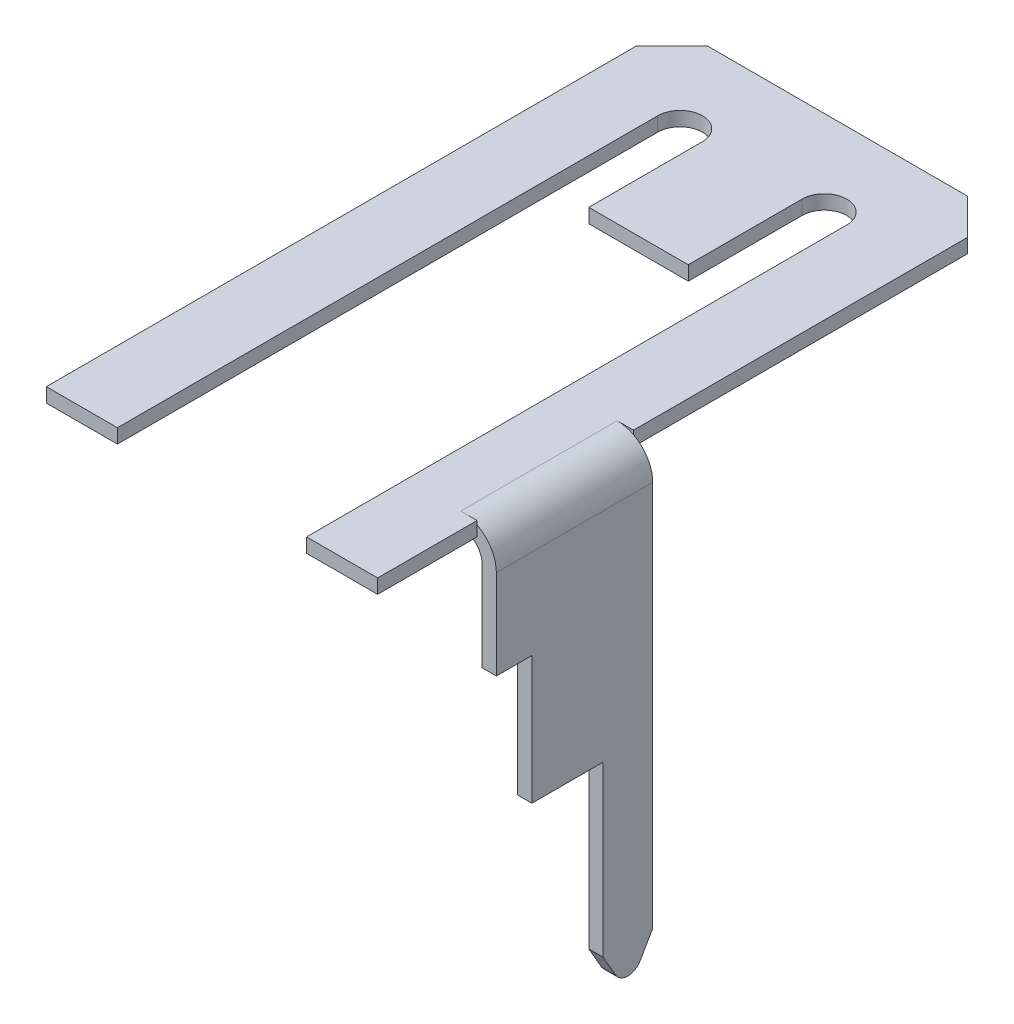
ISO-10303-21;
HEADER;
FILE_DESCRIPTION(('STEP AP214'),'2;1');
FILE_NAME('part.step','',(''),(''),'','','');
FILE_SCHEMA(('AUTOMOTIVE_DESIGN { 1 0 10303 214 1 1 1 1 }'));
ENDSEC;
DATA;
#1=APPLICATION_CONTEXT('core data for automotive mechanical design processes');
#2=APPLICATION_PROTOCOL_DEFINITION('international standard','automotive_design',2000,#1);
#3=PRODUCT_CONTEXT('',#1,'mechanical');
#4=PRODUCT('Part','Part','',(#3));
#5=PRODUCT_RELATED_PRODUCT_CATEGORY('part','',(#4));
#6=PRODUCT_DEFINITION_FORMATION('','',#4);
#7=PRODUCT_DEFINITION_CONTEXT('part definition',#1,'design');
#8=PRODUCT_DEFINITION('design','',#6,#7);
#9=PRODUCT_DEFINITION_SHAPE('','',#8);
#10=(LENGTH_UNIT() NAMED_UNIT(*) SI_UNIT(.MILLI.,.METRE.));
#11=(NAMED_UNIT(*) PLANE_ANGLE_UNIT() SI_UNIT($,.RADIAN.));
#12=(NAMED_UNIT(*) SI_UNIT($,.STERADIAN.) SOLID_ANGLE_UNIT());
#13=UNCERTAINTY_MEASURE_WITH_UNIT(LENGTH_MEASURE(1.E-05),#10,'distance_accuracy_value','');
#14=(GEOMETRIC_REPRESENTATION_CONTEXT(3) GLOBAL_UNCERTAINTY_ASSIGNED_CONTEXT((#13)) GLOBAL_UNIT_ASSIGNED_CONTEXT((#10,
#11,#12)) REPRESENTATION_CONTEXT('',''));
#15=CARTESIAN_POINT('',(0.,0.,0.));
#16=DIRECTION('',(0.,0.,1.));
#17=DIRECTION('',(1.,0.,0.));
#18=AXIS2_PLACEMENT_3D('',#15,#16,#17);
#19=CARTESIAN_POINT('',(8.42,-33.37318756642,-1.256));
#20=DIRECTION('',(-1.,0.,0.));
#21=DIRECTION('',(0.,0.,-1.));
#22=AXIS2_PLACEMENT_3D('',#19,#20,#21);
#23=PLANE('',#22);
#24=DIRECTION('',(0.,0.866025403784498,-0.499999999999897));
#25=VECTOR('',#24,1.);
#26=CARTESIAN_POINT('',(8.42,-39.07689110868,-3.4116025403785));
#27=LINE('',#26,#25);
#28=CARTESIAN_POINT('',(8.42,-38.9237822173509,-3.50000000000159));
#29=VERTEX_POINT('',#28);
#30=CARTESIAN_POINT('',(8.42,-39.2300000000006,-3.32320508075792));
#31=VERTEX_POINT('',#30);
#32=EDGE_CURVE('E305',#29,#31,#27,.F.);
#33=ORIENTED_EDGE('',*,*,#32,.T.);
#34=CARTESIAN_POINT('',(8.42,-39.13,-3.15));
#35=DIRECTION('',(1.,0.,0.));
#36=DIRECTION('',(0.,0.,-1.));
#37=AXIS2_PLACEMENT_3D('',#34,#35,#36);
#38=CIRCLE('',#37,0.2);
#39=CARTESIAN_POINT('',(8.42,-39.2300000000011,-2.97679491924106));
#40=VERTEX_POINT('',#39);
#41=EDGE_CURVE('E301',#31,#40,#38,.F.);
#42=ORIENTED_EDGE('',*,*,#41,.T.);
#43=DIRECTION('',(0.,-0.866025403784498,-0.499999999999897));
#44=VECTOR('',#43,1.);
#45=CARTESIAN_POINT('',(8.42,-39.07689110868,-2.8883974596215));
#46=LINE('',#45,#44);
#47=CARTESIAN_POINT('',(8.42,-38.9237822173505,-2.79999999999921));
#48=VERTEX_POINT('',#47);
#49=EDGE_CURVE('E295',#40,#48,#46,.F.);
#50=ORIENTED_EDGE('',*,*,#49,.T.);
#51=DIRECTION('',(0.,-1.,0.));
#52=VECTOR('',#51,1.);
#53=CARTESIAN_POINT('',(8.42,-37.736891108675,-2.8));
#54=LINE('',#53,#52);
#55=CARTESIAN_POINT('',(8.42,-36.55,-2.8));
#56=VERTEX_POINT('',#55);
#57=EDGE_CURVE('E284',#48,#56,#54,.F.);
#58=ORIENTED_EDGE('',*,*,#57,.T.);
#59=DIRECTION('',(0.,0.,-1.));
#60=VECTOR('',#59,1.);
#61=CARTESIAN_POINT('',(8.42,-36.55,-2.3));
#62=LINE('',#61,#60);
#63=CARTESIAN_POINT('',(8.42,-36.55,-1.8));
#64=VERTEX_POINT('',#63);
#65=EDGE_CURVE('E273',#56,#64,#62,.F.);
#66=ORIENTED_EDGE('',*,*,#65,.T.);
#67=DIRECTION('',(0.,-1.,0.));
#68=VECTOR('',#67,1.);
#69=CARTESIAN_POINT('',(8.42,-35.65,-1.8));
#70=LINE('',#69,#68);
#71=CARTESIAN_POINT('',(8.42,-34.75,-1.8));
#72=VERTEX_POINT('',#71);
#73=EDGE_CURVE('E262',#64,#72,#70,.F.);
#74=ORIENTED_EDGE('',*,*,#73,.T.);
#75=DIRECTION('',(0.,0.,-1.));
#76=VECTOR('',#75,1.);
#77=CARTESIAN_POINT('',(8.42,-34.75,-1.55));
#78=LINE('',#77,#76);
#79=CARTESIAN_POINT('',(8.42,-34.75,-1.3));
#80=VERTEX_POINT('',#79);
#81=EDGE_CURVE('E258',#72,#80,#78,.F.);
#82=ORIENTED_EDGE('',*,*,#81,.T.);
#83=DIRECTION('',(0.,1.,0.));
#84=VECTOR('',#83,1.);
#85=CARTESIAN_POINT('',(8.42,-36.410310839445,-1.3));
#86=LINE('',#85,#84);
#87=CARTESIAN_POINT('',(8.42,-33.49,-1.3));
#88=VERTEX_POINT('',#87);
#89=EDGE_CURVE('E317',#88,#80,#86,.F.);
#90=ORIENTED_EDGE('',*,*,#89,.F.);
#91=DIRECTION('',(0.,0.,1.));
#92=VECTOR('',#91,1.);
#93=CARTESIAN_POINT('',(8.42,-33.49,-2.4));
#94=LINE('',#93,#92);
#95=CARTESIAN_POINT('',(8.42,-33.49,-3.5));
#96=VERTEX_POINT('',#95);
#97=EDGE_CURVE('E255',#88,#96,#94,.F.);
#98=ORIENTED_EDGE('',*,*,#97,.T.);
#99=DIRECTION('',(0.,1.,0.));
#100=VECTOR('',#99,1.);
#101=CARTESIAN_POINT('',(8.42,-35.98491137987,-3.5));
#102=LINE('',#101,#100);
#103=EDGE_CURVE('E216',#96,#29,#102,.F.);
#104=ORIENTED_EDGE('',*,*,#103,.T.);
#105=EDGE_LOOP('',(#33,#42,#50,#58,#66,#74,#82,#90,#98,#104));
#106=FACE_BOUND('',#105,.T.);
#107=ADVANCED_FACE('F16',(#106),#23,.T.);
#108=CARTESIAN_POINT('',(8.634297051162,-39.04133705085,-3.5));
#109=DIRECTION('',(0.,0.,-1.));
#110=DIRECTION('',(-1.,0.,0.));
#111=AXIS2_PLACEMENT_3D('',#108,#109,#110);
#112=PLANE('',#111);
#113=DIRECTION('',(0.,1.,0.));
#114=VECTOR('',#113,1.);
#115=CARTESIAN_POINT('',(8.62,-36.410310839445,-3.5));
#116=LINE('',#115,#114);
#117=CARTESIAN_POINT('',(8.61999999999999,-33.49,-3.5));
#118=VERTEX_POINT('',#117);
#119=CARTESIAN_POINT('',(8.62,-38.9237822173534,-3.50000000000119));
#120=VERTEX_POINT('',#119);
#121=EDGE_CURVE('E209',#118,#120,#116,.F.);
#122=ORIENTED_EDGE('',*,*,#121,.T.);
#123=DIRECTION('',(1.,0.,0.));
#124=VECTOR('',#123,1.);
#125=CARTESIAN_POINT('',(8.52,-38.9237822173514,-3.50000000000238));
#126=LINE('',#125,#124);
#127=EDGE_CURVE('E215',#120,#29,#126,.F.);
#128=ORIENTED_EDGE('',*,*,#127,.T.);
#129=ORIENTED_EDGE('',*,*,#103,.F.);
#130=CARTESIAN_POINT('',(8.12,-33.49,-3.5));
#131=DIRECTION('',(0.,0.,-1.));
#132=DIRECTION('',(-1.,0.,0.));
#133=AXIS2_PLACEMENT_3D('',#130,#131,#132);
#134=CIRCLE('',#133,0.300000000000002);
#135=CARTESIAN_POINT('',(8.12,-33.19,-3.5));
#136=VERTEX_POINT('',#135);
#137=EDGE_CURVE('E226',#96,#136,#134,.F.);
#138=ORIENTED_EDGE('',*,*,#137,.T.);
#139=DIRECTION('',(1.,0.,0.));
#140=VECTOR('',#139,1.);
#141=CARTESIAN_POINT('',(8.37,-33.19,-3.5));
#142=LINE('',#141,#140);
#143=CARTESIAN_POINT('',(8.35,-33.19,-3.5));
#144=VERTEX_POINT('',#143);
#145=EDGE_CURVE('E310',#144,#136,#142,.F.);
#146=ORIENTED_EDGE('',*,*,#145,.F.);
#147=DIRECTION('',(0.,1.,0.));
#148=VECTOR('',#147,1.);
#149=CARTESIAN_POINT('',(8.35,-35.98491137987,-3.5));
#150=LINE('',#149,#148);
#151=CARTESIAN_POINT('',(8.35,-33.0460405423908,-3.5));
#152=VERTEX_POINT('',#151);
#153=EDGE_CURVE('E211',#152,#144,#150,.F.);
#154=ORIENTED_EDGE('',*,*,#153,.F.);
#155=CARTESIAN_POINT('',(8.12,-33.49,-3.5));
#156=DIRECTION('',(0.,0.,-1.));
#157=DIRECTION('',(-1.,0.,0.));
#158=AXIS2_PLACEMENT_3D('',#155,#156,#157);
#159=CIRCLE('',#158,0.499999999999994);
#160=EDGE_CURVE('E20',#118,#152,#159,.F.);
#161=ORIENTED_EDGE('',*,*,#160,.F.);
#162=EDGE_LOOP('',(#122,#128,#129,#138,#146,#154,#161));
#163=FACE_BOUND('',#162,.T.);
#164=ADVANCED_FACE('F207',(#163),#112,.T.);
#165=CARTESIAN_POINT('',(8.405702948838,-39.24238160951,-3.316056555176));
#166=DIRECTION('',(0.,-0.499999999999897,-0.866025403784498));
#167=DIRECTION('',(0.,0.866025403784498,-0.499999999999897));
#168=AXIS2_PLACEMENT_3D('',#165,#166,#167);
#169=PLANE('',#168);
#170=ORIENTED_EDGE('',*,*,#32,.F.);
#171=ORIENTED_EDGE('',*,*,#127,.F.);
#172=DIRECTION('',(0.,0.866025403784498,-0.499999999999897));
#173=VECTOR('',#172,1.);
#174=CARTESIAN_POINT('',(8.62,-39.24238160951,-3.316056555176));
#175=LINE('',#174,#173);
#176=CARTESIAN_POINT('',(8.62,-39.2300000000006,-3.32320508075792));
#177=VERTEX_POINT('',#176);
#178=EDGE_CURVE('E225',#120,#177,#175,.F.);
#179=ORIENTED_EDGE('',*,*,#178,.T.);
#180=DIRECTION('',(-1.,0.,0.));
#181=VECTOR('',#180,1.);
#182=CARTESIAN_POINT('',(8.52,-39.23,-3.32320508075691));
#183=LINE('',#182,#181);
#184=EDGE_CURVE('E302',#177,#31,#183,.T.);
#185=ORIENTED_EDGE('',*,*,#184,.T.);
#186=EDGE_LOOP('',(#170,#171,#179,#185));
#187=FACE_BOUND('',#186,.T.);
#188=ADVANCED_FACE('F393',(#187),#169,.T.);
#189=CARTESIAN_POINT('',(8.42,-39.13,-3.15));
#190=DIRECTION('',(1.,0.,0.));
#191=DIRECTION('',(0.,0.,-1.));
#192=AXIS2_PLACEMENT_3D('',#189,#190,#191);
#193=CYLINDRICAL_SURFACE('',#192,0.2);
#194=ORIENTED_EDGE('',*,*,#41,.F.);
#195=ORIENTED_EDGE('',*,*,#184,.F.);
#196=CARTESIAN_POINT('',(8.62,-39.13,-3.15));
#197=DIRECTION('',(1.,0.,0.));
#198=DIRECTION('',(0.,0.,-1.));
#199=AXIS2_PLACEMENT_3D('',#196,#197,#198);
#200=CIRCLE('',#199,0.2);
#201=CARTESIAN_POINT('',(8.62,-39.2300000000011,-2.97679491924106));
#202=VERTEX_POINT('',#201);
#203=EDGE_CURVE('E376',#177,#202,#200,.F.);
#204=ORIENTED_EDGE('',*,*,#203,.T.);
#205=DIRECTION('',(1.,0.,0.));
#206=VECTOR('',#205,1.);
#207=CARTESIAN_POINT('',(8.52,-39.2300000000011,-2.97679491924106));
#208=LINE('',#207,#206);
#209=EDGE_CURVE('E298',#202,#40,#208,.F.);
#210=ORIENTED_EDGE('',*,*,#209,.T.);
#211=EDGE_LOOP('',(#194,#195,#204,#210));
#212=FACE_BOUND('',#211,.T.);
#213=ADVANCED_FACE('F390',(#212),#193,.T.);
#214=CARTESIAN_POINT('',(8.405702948838,-38.91140060785,-2.792851474419));
#215=DIRECTION('',(0.,-0.499999999999897,0.866025403784498));
#216=DIRECTION('',(0.,-0.866025403784498,-0.499999999999897));
#217=AXIS2_PLACEMENT_3D('',#214,#215,#216);
#218=PLANE('',#217);
#219=ORIENTED_EDGE('',*,*,#49,.F.);
#220=ORIENTED_EDGE('',*,*,#209,.F.);
#221=DIRECTION('',(0.,-0.866025403784498,-0.499999999999897));
#222=VECTOR('',#221,1.);
#223=CARTESIAN_POINT('',(8.62,-38.91140060785,-2.792851474419));
#224=LINE('',#223,#222);
#225=CARTESIAN_POINT('',(8.62,-38.9237822173527,-2.8));
#226=VERTEX_POINT('',#225);
#227=EDGE_CURVE('E289',#202,#226,#224,.F.);
#228=ORIENTED_EDGE('',*,*,#227,.T.);
#229=DIRECTION('',(1.,0.,0.));
#230=VECTOR('',#229,1.);
#231=CARTESIAN_POINT('',(8.52,-38.92378221735,-2.8));
#232=LINE('',#231,#230);
#233=EDGE_CURVE('E292',#226,#48,#232,.F.);
#234=ORIENTED_EDGE('',*,*,#233,.T.);
#235=EDGE_LOOP('',(#219,#220,#228,#234));
#236=FACE_BOUND('',#235,.T.);
#237=ADVANCED_FACE('F388',(#236),#218,.T.);
#238=CARTESIAN_POINT('',(8.405702948838,-36.50252435565,-2.8));
#239=DIRECTION('',(0.,0.,1.));
#240=DIRECTION('',(0.,-1.,0.));
#241=AXIS2_PLACEMENT_3D('',#238,#239,#240);
#242=PLANE('',#241);
#243=ORIENTED_EDGE('',*,*,#57,.F.);
#244=ORIENTED_EDGE('',*,*,#233,.F.);
#245=DIRECTION('',(0.,-1.,0.));
#246=VECTOR('',#245,1.);
#247=CARTESIAN_POINT('',(8.62,-36.410310839445,-2.8));
#248=LINE('',#247,#246);
#249=CARTESIAN_POINT('',(8.62,-36.55,-2.8));
#250=VERTEX_POINT('',#249);
#251=EDGE_CURVE('E278',#226,#250,#248,.F.);
#252=ORIENTED_EDGE('',*,*,#251,.T.);
#253=DIRECTION('',(1.,0.,0.));
#254=VECTOR('',#253,1.);
#255=CARTESIAN_POINT('',(8.52,-36.55,-2.8));
#256=LINE('',#255,#254);
#257=EDGE_CURVE('E281',#250,#56,#256,.F.);
#258=ORIENTED_EDGE('',*,*,#257,.T.);
#259=EDGE_LOOP('',(#243,#244,#252,#258));
#260=FACE_BOUND('',#259,.T.);
#261=ADVANCED_FACE('F864',(#260),#242,.T.);
#262=CARTESIAN_POINT('',(8.405702948838,-36.55,-1.78));
#263=DIRECTION('',(0.,-1.,0.));
#264=DIRECTION('',(0.,0.,-1.));
#265=AXIS2_PLACEMENT_3D('',#262,#263,#264);
#266=PLANE('',#265);
#267=ORIENTED_EDGE('',*,*,#65,.F.);
#268=ORIENTED_EDGE('',*,*,#257,.F.);
#269=DIRECTION('',(0.,0.,-1.));
#270=VECTOR('',#269,1.);
#271=CARTESIAN_POINT('',(8.62,-36.55,-2.4));
#272=LINE('',#271,#270);
#273=CARTESIAN_POINT('',(8.62,-36.55,-1.8));
#274=VERTEX_POINT('',#273);
#275=EDGE_CURVE('E267',#250,#274,#272,.F.);
#276=ORIENTED_EDGE('',*,*,#275,.T.);
#277=DIRECTION('',(1.,0.,0.));
#278=VECTOR('',#277,1.);
#279=CARTESIAN_POINT('',(8.52,-36.55,-1.8));
#280=LINE('',#279,#278);
#281=EDGE_CURVE('E270',#274,#64,#280,.F.);
#282=ORIENTED_EDGE('',*,*,#281,.T.);
#283=EDGE_LOOP('',(#267,#268,#276,#282));
#284=FACE_BOUND('',#283,.T.);
#285=ADVANCED_FACE('F854',(#284),#266,.T.);
#286=CARTESIAN_POINT('',(8.405702948838,-34.714,-1.8));
#287=DIRECTION('',(0.,0.,1.));
#288=DIRECTION('',(0.,-1.,0.));
#289=AXIS2_PLACEMENT_3D('',#286,#287,#288);
#290=PLANE('',#289);
#291=ORIENTED_EDGE('',*,*,#73,.F.);
#292=ORIENTED_EDGE('',*,*,#281,.F.);
#293=DIRECTION('',(0.,-1.,0.));
#294=VECTOR('',#293,1.);
#295=CARTESIAN_POINT('',(8.62,-36.410310839445,-1.8));
#296=LINE('',#295,#294);
#297=CARTESIAN_POINT('',(8.62,-34.75,-1.8));
#298=VERTEX_POINT('',#297);
#299=EDGE_CURVE('E246',#274,#298,#296,.F.);
#300=ORIENTED_EDGE('',*,*,#299,.T.);
#301=DIRECTION('',(1.,0.,0.));
#302=VECTOR('',#301,1.);
#303=CARTESIAN_POINT('',(8.52,-34.75,-1.8));
#304=LINE('',#303,#302);
#305=EDGE_CURVE('E259',#298,#72,#304,.F.);
#306=ORIENTED_EDGE('',*,*,#305,.T.);
#307=EDGE_LOOP('',(#291,#292,#300,#306));
#308=FACE_BOUND('',#307,.T.);
#309=ADVANCED_FACE('F844',(#308),#290,.T.);
#310=CARTESIAN_POINT('',(8.405702948838,-34.75,-1.285702948838));
#311=DIRECTION('',(0.,-1.,0.));
#312=DIRECTION('',(0.,0.,-1.));
#313=AXIS2_PLACEMENT_3D('',#310,#311,#312);
#314=PLANE('',#313);
#315=ORIENTED_EDGE('',*,*,#81,.F.);
#316=ORIENTED_EDGE('',*,*,#305,.F.);
#317=DIRECTION('',(0.,0.,-1.));
#318=VECTOR('',#317,1.);
#319=CARTESIAN_POINT('',(8.62,-34.75,-2.4));
#320=LINE('',#319,#318);
#321=CARTESIAN_POINT('',(8.62,-34.75,-1.3));
#322=VERTEX_POINT('',#321);
#323=EDGE_CURVE('E243',#298,#322,#320,.F.);
#324=ORIENTED_EDGE('',*,*,#323,.T.);
#325=DIRECTION('',(1.,0.,0.));
#326=VECTOR('',#325,1.);
#327=CARTESIAN_POINT('',(8.37,-34.75,-1.3));
#328=LINE('',#327,#326);
#329=EDGE_CURVE('E249',#322,#80,#328,.F.);
#330=ORIENTED_EDGE('',*,*,#329,.T.);
#331=EDGE_LOOP('',(#315,#316,#324,#330));
#332=FACE_BOUND('',#331,.T.);
#333=ADVANCED_FACE('F835',(#332),#314,.T.);
#334=CARTESIAN_POINT('',(8.12,-33.49,-1.3));
#335=DIRECTION('',(0.,0.,-1.));
#336=DIRECTION('',(-1.,0.,0.));
#337=AXIS2_PLACEMENT_3D('',#334,#335,#336);
#338=CYLINDRICAL_SURFACE('',#337,0.300000000000002);
#339=ORIENTED_EDGE('',*,*,#97,.F.);
#340=CARTESIAN_POINT('',(8.12,-33.49,-1.3));
#341=DIRECTION('',(0.,0.,-1.));
#342=DIRECTION('',(-1.,0.,0.));
#343=AXIS2_PLACEMENT_3D('',#340,#341,#342);
#344=CIRCLE('',#343,0.300000000000002);
#345=CARTESIAN_POINT('',(8.12,-33.19,-1.3));
#346=VERTEX_POINT('',#345);
#347=EDGE_CURVE('E245',#88,#346,#344,.F.);
#348=ORIENTED_EDGE('',*,*,#347,.T.);
#349=DIRECTION('',(0.,0.,1.));
#350=VECTOR('',#349,1.);
#351=CARTESIAN_POINT('',(8.12,-33.19,-4.3));
#352=LINE('',#351,#350);
#353=EDGE_CURVE('E232',#346,#136,#352,.F.);
#354=ORIENTED_EDGE('',*,*,#353,.T.);
#355=ORIENTED_EDGE('',*,*,#137,.F.);
#356=EDGE_LOOP('',(#339,#348,#354,#355));
#357=FACE_BOUND('',#356,.T.);
#358=ADVANCED_FACE('F397',(#357),#338,.F.);
#359=CARTESIAN_POINT('',(8.62,-39.44743411247,-1.256));
#360=DIRECTION('',(1.,0.,0.));
#361=DIRECTION('',(0.,0.,-1.));
#362=AXIS2_PLACEMENT_3D('',#359,#360,#361);
#363=PLANE('',#362);
#364=DIRECTION('',(0.,1.,0.));
#365=VECTOR('',#364,1.);
#366=CARTESIAN_POINT('',(8.62,-33.898020271195,-1.3));
#367=LINE('',#366,#365);
#368=CARTESIAN_POINT('',(8.61999999999999,-33.49,-1.3));
#369=VERTEX_POINT('',#368);
#370=EDGE_CURVE('E252',#369,#322,#367,.F.);
#371=ORIENTED_EDGE('',*,*,#370,.T.);
#372=ORIENTED_EDGE('',*,*,#323,.F.);
#373=ORIENTED_EDGE('',*,*,#299,.F.);
#374=ORIENTED_EDGE('',*,*,#275,.F.);
#375=ORIENTED_EDGE('',*,*,#251,.F.);
#376=ORIENTED_EDGE('',*,*,#227,.F.);
#377=ORIENTED_EDGE('',*,*,#203,.F.);
#378=ORIENTED_EDGE('',*,*,#178,.F.);
#379=ORIENTED_EDGE('',*,*,#121,.F.);
#380=DIRECTION('',(0.,0.,1.));
#381=VECTOR('',#380,1.);
#382=CARTESIAN_POINT('',(8.61999999999999,-33.49,-2.4));
#383=LINE('',#382,#381);
#384=EDGE_CURVE('E222',#118,#369,#383,.T.);
#385=ORIENTED_EDGE('',*,*,#384,.T.);
#386=EDGE_LOOP('',(#371,#372,#373,#374,#375,#376,#377,#378,#379,#385));
#387=FACE_BOUND('',#386,.T.);
#388=ADVANCED_FACE('F221',(#387),#363,.T.);
#389=CARTESIAN_POINT('',(8.105702948838,-34.78407918915,-1.3));
#390=DIRECTION('',(0.,0.,1.));
#391=DIRECTION('',(1.,0.,0.));
#392=AXIS2_PLACEMENT_3D('',#389,#390,#391);
#393=PLANE('',#392);
#394=ORIENTED_EDGE('',*,*,#370,.F.);
#395=CARTESIAN_POINT('',(8.12,-33.49,-1.3));
#396=DIRECTION('',(0.,0.,-1.));
#397=DIRECTION('',(-1.,0.,0.));
#398=AXIS2_PLACEMENT_3D('',#395,#396,#397);
#399=CIRCLE('',#398,0.499999999999994);
#400=CARTESIAN_POINT('',(8.35,-33.0460405423908,-1.3));
#401=VERTEX_POINT('',#400);
#402=EDGE_CURVE('E231',#369,#401,#399,.F.);
#403=ORIENTED_EDGE('',*,*,#402,.T.);
#404=DIRECTION('',(0.,1.,0.));
#405=VECTOR('',#404,1.);
#406=CARTESIAN_POINT('',(8.35,-33.09,-1.3));
#407=LINE('',#406,#405);
#408=CARTESIAN_POINT('',(8.35,-33.19,-1.3));
#409=VERTEX_POINT('',#408);
#410=EDGE_CURVE('E534',#401,#409,#407,.F.);
#411=ORIENTED_EDGE('',*,*,#410,.T.);
#412=DIRECTION('',(1.,0.,0.));
#413=VECTOR('',#412,1.);
#414=CARTESIAN_POINT('',(6.02,-33.19,-1.3));
#415=LINE('',#414,#413);
#416=EDGE_CURVE('E237',#409,#346,#415,.F.);
#417=ORIENTED_EDGE('',*,*,#416,.T.);
#418=ORIENTED_EDGE('',*,*,#347,.F.);
#419=ORIENTED_EDGE('',*,*,#89,.T.);
#420=ORIENTED_EDGE('',*,*,#329,.F.);
#421=EDGE_LOOP('',(#394,#403,#411,#417,#418,#419,#420));
#422=FACE_BOUND('',#421,.T.);
#423=ADVANCED_FACE('F403',(#422),#393,.T.);
#424=CARTESIAN_POINT('',(8.4432,-33.19,0.276));
#425=DIRECTION('',(0.,-1.,0.));
#426=DIRECTION('',(-1.,0.,0.));
#427=AXIS2_PLACEMENT_3D('',#424,#425,#426);
#428=PLANE('',#427);
#429=ORIENTED_EDGE('',*,*,#353,.F.);
#430=ORIENTED_EDGE('',*,*,#416,.F.);
#431=DIRECTION('',(0.,0.,-1.));
#432=VECTOR('',#431,1.);
#433=CARTESIAN_POINT('',(8.35,-33.19,-4.05));
#434=LINE('',#433,#432);
#435=CARTESIAN_POINT('',(8.35,-33.19,0.0999999999999998));
#436=VERTEX_POINT('',#435);
#437=EDGE_CURVE('E525',#409,#436,#434,.F.);
#438=ORIENTED_EDGE('',*,*,#437,.T.);
#439=DIRECTION('',(1.,0.,0.));
#440=VECTOR('',#439,1.);
#441=CARTESIAN_POINT('',(6.02,-33.19,0.1));
#442=LINE('',#441,#440);
#443=CARTESIAN_POINT('',(7.35,-33.19,0.0999999999999999));
#444=VERTEX_POINT('',#443);
#445=EDGE_CURVE('E514',#436,#444,#442,.F.);
#446=ORIENTED_EDGE('',*,*,#445,.T.);
#447=DIRECTION('',(0.,0.,-1.));
#448=VECTOR('',#447,1.);
#449=CARTESIAN_POINT('',(7.35,-33.19,-3.7));
#450=LINE('',#449,#448);
#451=CARTESIAN_POINT('',(7.35,-33.19,-7.5));
#452=VERTEX_POINT('',#451);
#453=EDGE_CURVE('E510',#444,#452,#450,.T.);
#454=ORIENTED_EDGE('',*,*,#453,.T.);
#455=CARTESIAN_POINT('',(7.035,-33.19,-7.5));
#456=DIRECTION('',(0.,1.,0.));
#457=DIRECTION('',(0.,0.,1.));
#458=AXIS2_PLACEMENT_3D('',#455,#456,#457);
#459=CIRCLE('',#458,0.314999999999999);
#460=CARTESIAN_POINT('',(6.72,-33.19,-7.5));
#461=VERTEX_POINT('',#460);
#462=EDGE_CURVE('E367',#452,#461,#459,.T.);
#463=ORIENTED_EDGE('',*,*,#462,.T.);
#464=DIRECTION('',(0.,0.,1.));
#465=VECTOR('',#464,1.);
#466=CARTESIAN_POINT('',(6.72,-33.19,-6.7));
#467=LINE('',#466,#465);
#468=CARTESIAN_POINT('',(6.72,-33.19,-5.9));
#469=VERTEX_POINT('',#468);
#470=EDGE_CURVE('E503',#461,#469,#467,.T.);
#471=ORIENTED_EDGE('',*,*,#470,.T.);
#472=DIRECTION('',(-1.,0.,0.));
#473=VECTOR('',#472,1.);
#474=CARTESIAN_POINT('',(6.02,-33.19,-5.9));
#475=LINE('',#474,#473);
#476=CARTESIAN_POINT('',(5.32,-33.19,-5.9));
#477=VERTEX_POINT('',#476);
#478=EDGE_CURVE('E492',#469,#477,#475,.T.);
#479=ORIENTED_EDGE('',*,*,#478,.T.);
#480=DIRECTION('',(0.,0.,-1.));
#481=VECTOR('',#480,1.);
#482=CARTESIAN_POINT('',(5.32,-33.19,-6.7));
#483=LINE('',#482,#481);
#484=CARTESIAN_POINT('',(5.32,-33.19,-7.5));
#485=VERTEX_POINT('',#484);
#486=EDGE_CURVE('E488',#477,#485,#483,.T.);
#487=ORIENTED_EDGE('',*,*,#486,.T.);
#488=CARTESIAN_POINT('',(5.005,-33.19,-7.5));
#489=DIRECTION('',(0.,1.,0.));
#490=DIRECTION('',(0.,0.,1.));
#491=AXIS2_PLACEMENT_3D('',#488,#489,#490);
#492=CIRCLE('',#491,0.314999999999999);
#493=CARTESIAN_POINT('',(4.69,-33.19,-7.5));
#494=VERTEX_POINT('',#493);
#495=EDGE_CURVE('E363',#485,#494,#492,.T.);
#496=ORIENTED_EDGE('',*,*,#495,.T.);
#497=DIRECTION('',(0.,0.,1.));
#498=VECTOR('',#497,1.);
#499=CARTESIAN_POINT('',(4.69,-33.19,-3.7));
#500=LINE('',#499,#498);
#501=CARTESIAN_POINT('',(4.69,-33.19,0.0999999999999999));
#502=VERTEX_POINT('',#501);
#503=EDGE_CURVE('E481',#494,#502,#500,.T.);
#504=ORIENTED_EDGE('',*,*,#503,.T.);
#505=DIRECTION('',(1.,0.,0.));
#506=VECTOR('',#505,1.);
#507=CARTESIAN_POINT('',(6.02,-33.19,0.1));
#508=LINE('',#507,#506);
#509=CARTESIAN_POINT('',(3.69,-33.19,0.1));
#510=VERTEX_POINT('',#509);
#511=EDGE_CURVE('E471',#502,#510,#508,.F.);
#512=ORIENTED_EDGE('',*,*,#511,.T.);
#513=DIRECTION('',(0.,0.,1.));
#514=VECTOR('',#513,1.);
#515=CARTESIAN_POINT('',(3.69,-33.19,-4.05));
#516=LINE('',#515,#514);
#517=CARTESIAN_POINT('',(3.69,-33.19,-8.2));
#518=VERTEX_POINT('',#517);
#519=EDGE_CURVE('E460',#510,#518,#516,.F.);
#520=ORIENTED_EDGE('',*,*,#519,.T.);
#521=DIRECTION('',(-0.707106781186547,0.,0.707106781186548));
#522=VECTOR('',#521,1.);
#523=CARTESIAN_POINT('',(3.94,-33.19,-8.45));
#524=LINE('',#523,#522);
#525=CARTESIAN_POINT('',(4.19,-33.19,-8.7));
#526=VERTEX_POINT('',#525);
#527=EDGE_CURVE('E454',#518,#526,#524,.F.);
#528=ORIENTED_EDGE('',*,*,#527,.T.);
#529=DIRECTION('',(-1.,0.,0.));
#530=VECTOR('',#529,1.);
#531=CARTESIAN_POINT('',(6.02,-33.19,-8.7));
#532=LINE('',#531,#530);
#533=CARTESIAN_POINT('',(7.85,-33.19,-8.7));
#534=VERTEX_POINT('',#533);
#535=EDGE_CURVE('E446',#526,#534,#532,.F.);
#536=ORIENTED_EDGE('',*,*,#535,.T.);
#537=DIRECTION('',(-0.707106781186549,0.,-0.707106781186546));
#538=VECTOR('',#537,1.);
#539=CARTESIAN_POINT('',(8.1,-33.19,-8.45));
#540=LINE('',#539,#538);
#541=CARTESIAN_POINT('',(8.35,-33.19,-8.2));
#542=VERTEX_POINT('',#541);
#543=EDGE_CURVE('E413',#534,#542,#540,.F.);
#544=ORIENTED_EDGE('',*,*,#543,.T.);
#545=DIRECTION('',(0.,0.,-1.));
#546=VECTOR('',#545,1.);
#547=CARTESIAN_POINT('',(8.35,-33.19,-4.05));
#548=LINE('',#547,#546);
#549=EDGE_CURVE('E411',#542,#144,#548,.F.);
#550=ORIENTED_EDGE('',*,*,#549,.T.);
#551=ORIENTED_EDGE('',*,*,#145,.T.);
#552=EDGE_LOOP('',(#429,#430,#438,#446,#454,#463,#471,#479,#487,#496,#504,#512,#520,#528,#536,
#544,#550,#551));
#553=FACE_BOUND('',#552,.T.);
#554=ADVANCED_FACE('F407',(#553),#428,.T.);
#555=CARTESIAN_POINT('',(8.12,-33.49,-1.3));
#556=DIRECTION('',(0.,0.,-1.));
#557=DIRECTION('',(-1.,0.,0.));
#558=AXIS2_PLACEMENT_3D('',#555,#556,#557);
#559=CYLINDRICAL_SURFACE('',#558,0.499999999999994);
#560=CARTESIAN_POINT('',(8.12,-33.49,-3.5));
#561=DIRECTION('',(0.,0.,-1.));
#562=DIRECTION('',(-1.,0.,0.));
#563=AXIS2_PLACEMENT_3D('',#560,#561,#562);
#564=CIRCLE('',#563,0.499999999999994);
#565=CARTESIAN_POINT('',(8.12,-32.99,-3.5));
#566=VERTEX_POINT('',#565);
#567=EDGE_CURVE('E360',#152,#566,#564,.F.);
#568=ORIENTED_EDGE('',*,*,#567,.T.);
#569=DIRECTION('',(0.,0.,1.));
#570=VECTOR('',#569,1.);
#571=CARTESIAN_POINT('',(8.12,-32.99,-4.3));
#572=LINE('',#571,#570);
#573=CARTESIAN_POINT('',(8.12,-32.99,-1.3));
#574=VERTEX_POINT('',#573);
#575=EDGE_CURVE('E362',#566,#574,#572,.T.);
#576=ORIENTED_EDGE('',*,*,#575,.T.);
#577=CARTESIAN_POINT('',(8.12,-33.49,-1.3));
#578=DIRECTION('',(0.,0.,-1.));
#579=DIRECTION('',(-1.,0.,0.));
#580=AXIS2_PLACEMENT_3D('',#577,#578,#579);
#581=CIRCLE('',#580,0.499999999999994);
#582=EDGE_CURVE('E234',#574,#401,#581,.T.);
#583=ORIENTED_EDGE('',*,*,#582,.T.);
#584=ORIENTED_EDGE('',*,*,#402,.F.);
#585=ORIENTED_EDGE('',*,*,#384,.F.);
#586=ORIENTED_EDGE('',*,*,#160,.T.);
#587=EDGE_LOOP('',(#568,#576,#583,#584,#585,#586));
#588=FACE_BOUND('',#587,.T.);
#589=ADVANCED_FACE('F229',(#588),#559,.T.);
#590=CARTESIAN_POINT('',(8.105702948838,-33.06033759355,-1.3));
#591=DIRECTION('',(0.,0.,1.));
#592=DIRECTION('',(1.,0.,0.));
#593=AXIS2_PLACEMENT_3D('',#590,#591,#592);
#594=PLANE('',#593);
#595=DIRECTION('',(1.,0.,0.));
#596=VECTOR('',#595,1.);
#597=CARTESIAN_POINT('',(6.02,-32.99,-1.3));
#598=LINE('',#597,#596);
#599=CARTESIAN_POINT('',(8.35,-32.99,-1.3));
#600=VERTEX_POINT('',#599);
#601=EDGE_CURVE('E427',#574,#600,#598,.T.);
#602=ORIENTED_EDGE('',*,*,#601,.T.);
#603=DIRECTION('',(0.,1.,0.));
#604=VECTOR('',#603,1.);
#605=CARTESIAN_POINT('',(8.35,-33.09,-1.3));
#606=LINE('',#605,#604);
#607=EDGE_CURVE('E371',#600,#401,#606,.F.);
#608=ORIENTED_EDGE('',*,*,#607,.T.);
#609=ORIENTED_EDGE('',*,*,#582,.F.);
#610=EDGE_LOOP('',(#602,#608,#609));
#611=FACE_BOUND('',#610,.T.);
#612=ADVANCED_FACE('F588',(#611),#594,.F.);
#613=CARTESIAN_POINT('',(8.35,-32.97570294884,-8.366));
#614=DIRECTION('',(1.,0.,0.));
#615=DIRECTION('',(0.,0.,1.));
#616=AXIS2_PLACEMENT_3D('',#613,#614,#615);
#617=PLANE('',#616);
#618=DIRECTION('',(0.,1.,0.));
#619=VECTOR('',#618,1.);
#620=CARTESIAN_POINT('',(8.35,-33.09,0.1));
#621=LINE('',#620,#619);
#622=CARTESIAN_POINT('',(8.35,-32.99,0.1));
#623=VERTEX_POINT('',#622);
#624=EDGE_CURVE('E522',#623,#436,#621,.F.);
#625=ORIENTED_EDGE('',*,*,#624,.T.);
#626=ORIENTED_EDGE('',*,*,#437,.F.);
#627=ORIENTED_EDGE('',*,*,#410,.F.);
#628=ORIENTED_EDGE('',*,*,#607,.F.);
#629=DIRECTION('',(0.,0.,1.));
#630=VECTOR('',#629,1.);
#631=CARTESIAN_POINT('',(8.35,-32.99,-4.3));
#632=LINE('',#631,#630);
#633=EDGE_CURVE('E430',#600,#623,#632,.T.);
#634=ORIENTED_EDGE('',*,*,#633,.T.);
#635=EDGE_LOOP('',(#625,#626,#627,#628,#634));
#636=FACE_BOUND('',#635,.T.);
#637=ADVANCED_FACE('F585',(#636),#617,.T.);
#638=CARTESIAN_POINT('',(8.4432,-32.97570294884,0.1));
#639=DIRECTION('',(0.,0.,1.));
#640=DIRECTION('',(-1.,0.,0.));
#641=AXIS2_PLACEMENT_3D('',#638,#639,#640);
#642=PLANE('',#641);
#643=ORIENTED_EDGE('',*,*,#445,.F.);
#644=ORIENTED_EDGE('',*,*,#624,.F.);
#645=DIRECTION('',(-1.,0.,0.));
#646=VECTOR('',#645,1.);
#647=CARTESIAN_POINT('',(6.02,-32.99,0.0999999999999999));
#648=LINE('',#647,#646);
#649=CARTESIAN_POINT('',(7.35,-32.99,0.1));
#650=VERTEX_POINT('',#649);
#651=EDGE_CURVE('E517',#623,#650,#648,.T.);
#652=ORIENTED_EDGE('',*,*,#651,.T.);
#653=DIRECTION('',(0.,-1.,0.));
#654=VECTOR('',#653,1.);
#655=CARTESIAN_POINT('',(7.35,-33.09,0.1));
#656=LINE('',#655,#654);
#657=EDGE_CURVE('E511',#650,#444,#656,.T.);
#658=ORIENTED_EDGE('',*,*,#657,.T.);
#659=EDGE_LOOP('',(#643,#644,#652,#658));
#660=FACE_BOUND('',#659,.T.);
#661=ADVANCED_FACE('F593',(#660),#642,.T.);
#662=CARTESIAN_POINT('',(7.35,-33.20429705116,0.252));
#663=DIRECTION('',(1.,0.,0.));
#664=DIRECTION('',(0.,0.,-1.));
#665=AXIS2_PLACEMENT_3D('',#662,#663,#664);
#666=PLANE('',#665);
#667=ORIENTED_EDGE('',*,*,#453,.F.);
#668=ORIENTED_EDGE('',*,*,#657,.F.);
#669=DIRECTION('',(0.,0.,-1.));
#670=VECTOR('',#669,1.);
#671=CARTESIAN_POINT('',(7.35,-32.99,-4.3));
#672=LINE('',#671,#670);
#673=CARTESIAN_POINT('',(7.35,-32.99,-7.5));
#674=VERTEX_POINT('',#673);
#675=EDGE_CURVE('E359',#650,#674,#672,.T.);
#676=ORIENTED_EDGE('',*,*,#675,.T.);
#677=DIRECTION('',(0.,1.,0.));
#678=VECTOR('',#677,1.);
#679=CARTESIAN_POINT('',(7.35,-33.09,-7.5));
#680=LINE('',#679,#678);
#681=EDGE_CURVE('E370',#674,#452,#680,.F.);
#682=ORIENTED_EDGE('',*,*,#681,.T.);
#683=EDGE_LOOP('',(#667,#668,#676,#682));
#684=FACE_BOUND('',#683,.T.);
#685=ADVANCED_FACE('F597',(#684),#666,.F.);
#686=CARTESIAN_POINT('',(7.035,-33.19,-7.5));
#687=DIRECTION('',(0.,1.,0.));
#688=DIRECTION('',(0.,0.,1.));
#689=AXIS2_PLACEMENT_3D('',#686,#687,#688);
#690=CYLINDRICAL_SURFACE('',#689,0.314999999999999);
#691=ORIENTED_EDGE('',*,*,#462,.F.);
#692=ORIENTED_EDGE('',*,*,#681,.F.);
#693=CARTESIAN_POINT('',(7.035,-32.99,-7.5));
#694=DIRECTION('',(0.,1.,0.));
#695=DIRECTION('',(0.,0.,1.));
#696=AXIS2_PLACEMENT_3D('',#693,#694,#695);
#697=CIRCLE('',#696,0.314999999999999);
#698=CARTESIAN_POINT('',(6.72,-32.99,-7.5));
#699=VERTEX_POINT('',#698);
#700=EDGE_CURVE('E355',#674,#699,#697,.T.);
#701=ORIENTED_EDGE('',*,*,#700,.T.);
#702=DIRECTION('',(0.,-1.,0.));
#703=VECTOR('',#702,1.);
#704=CARTESIAN_POINT('',(6.72,-33.09,-7.5));
#705=LINE('',#704,#703);
#706=EDGE_CURVE('E369',#699,#461,#705,.T.);
#707=ORIENTED_EDGE('',*,*,#706,.T.);
#708=EDGE_LOOP('',(#691,#692,#701,#707));
#709=FACE_BOUND('',#708,.T.);
#710=ADVANCED_FACE('F601',(#709),#690,.F.);
#711=CARTESIAN_POINT('',(6.72,-33.20429705116,-7.532));
#712=DIRECTION('',(-1.,0.,0.));
#713=DIRECTION('',(0.,0.,1.));
#714=AXIS2_PLACEMENT_3D('',#711,#712,#713);
#715=PLANE('',#714);
#716=ORIENTED_EDGE('',*,*,#470,.F.);
#717=ORIENTED_EDGE('',*,*,#706,.F.);
#718=DIRECTION('',(0.,0.,1.));
#719=VECTOR('',#718,1.);
#720=CARTESIAN_POINT('',(6.72,-32.99,-4.3));
#721=LINE('',#720,#719);
#722=CARTESIAN_POINT('',(6.72,-32.99,-5.9));
#723=VERTEX_POINT('',#722);
#724=EDGE_CURVE('E358',#699,#723,#721,.T.);
#725=ORIENTED_EDGE('',*,*,#724,.T.);
#726=DIRECTION('',(0.,-1.,0.));
#727=VECTOR('',#726,1.);
#728=CARTESIAN_POINT('',(6.72,-33.09,-5.9));
#729=LINE('',#728,#727);
#730=EDGE_CURVE('E500',#723,#469,#729,.T.);
#731=ORIENTED_EDGE('',*,*,#730,.T.);
#732=EDGE_LOOP('',(#716,#717,#725,#731));
#733=FACE_BOUND('',#732,.T.);
#734=ADVANCED_FACE('F638',(#733),#715,.F.);
#735=CARTESIAN_POINT('',(6.748,-33.20429705116,-5.9));
#736=DIRECTION('',(0.,0.,-1.));
#737=DIRECTION('',(-1.,0.,0.));
#738=AXIS2_PLACEMENT_3D('',#735,#736,#737);
#739=PLANE('',#738);
#740=ORIENTED_EDGE('',*,*,#478,.F.);
#741=ORIENTED_EDGE('',*,*,#730,.F.);
#742=DIRECTION('',(-1.,0.,0.));
#743=VECTOR('',#742,1.);
#744=CARTESIAN_POINT('',(6.02,-32.99,-5.9));
#745=LINE('',#744,#743);
#746=CARTESIAN_POINT('',(5.32,-32.99,-5.9));
#747=VERTEX_POINT('',#746);
#748=EDGE_CURVE('E495',#723,#747,#745,.T.);
#749=ORIENTED_EDGE('',*,*,#748,.T.);
#750=DIRECTION('',(0.,-1.,0.));
#751=VECTOR('',#750,1.);
#752=CARTESIAN_POINT('',(5.32,-33.09,-5.9));
#753=LINE('',#752,#751);
#754=EDGE_CURVE('E489',#747,#477,#753,.T.);
#755=ORIENTED_EDGE('',*,*,#754,.T.);
#756=EDGE_LOOP('',(#740,#741,#749,#755));
#757=FACE_BOUND('',#756,.T.);
#758=ADVANCED_FACE('F636',(#757),#739,.F.);
#759=CARTESIAN_POINT('',(5.32,-33.20429705116,-5.868));
#760=DIRECTION('',(1.,0.,0.));
#761=DIRECTION('',(0.,0.,-1.));
#762=AXIS2_PLACEMENT_3D('',#759,#760,#761);
#763=PLANE('',#762);
#764=ORIENTED_EDGE('',*,*,#486,.F.);
#765=ORIENTED_EDGE('',*,*,#754,.F.);
#766=DIRECTION('',(0.,0.,-1.));
#767=VECTOR('',#766,1.);
#768=CARTESIAN_POINT('',(5.32,-32.99,-4.3));
#769=LINE('',#768,#767);
#770=CARTESIAN_POINT('',(5.32,-32.99,-7.5));
#771=VERTEX_POINT('',#770);
#772=EDGE_CURVE('E354',#747,#771,#769,.T.);
#773=ORIENTED_EDGE('',*,*,#772,.T.);
#774=DIRECTION('',(0.,1.,0.));
#775=VECTOR('',#774,1.);
#776=CARTESIAN_POINT('',(5.32,-33.09,-7.5));
#777=LINE('',#776,#775);
#778=EDGE_CURVE('E366',#771,#485,#777,.F.);
#779=ORIENTED_EDGE('',*,*,#778,.T.);
#780=EDGE_LOOP('',(#764,#765,#773,#779));
#781=FACE_BOUND('',#780,.T.);
#782=ADVANCED_FACE('F633',(#781),#763,.F.);
#783=CARTESIAN_POINT('',(5.005,-33.19,-7.5));
#784=DIRECTION('',(0.,1.,0.));
#785=DIRECTION('',(0.,0.,1.));
#786=AXIS2_PLACEMENT_3D('',#783,#784,#785);
#787=CYLINDRICAL_SURFACE('',#786,0.314999999999999);
#788=ORIENTED_EDGE('',*,*,#495,.F.);
#789=ORIENTED_EDGE('',*,*,#778,.F.);
#790=CARTESIAN_POINT('',(5.005,-32.99,-7.5));
#791=DIRECTION('',(0.,1.,0.));
#792=DIRECTION('',(0.,0.,1.));
#793=AXIS2_PLACEMENT_3D('',#790,#791,#792);
#794=CIRCLE('',#793,0.314999999999999);
#795=CARTESIAN_POINT('',(4.69,-32.99,-7.5));
#796=VERTEX_POINT('',#795);
#797=EDGE_CURVE('E350',#771,#796,#794,.T.);
#798=ORIENTED_EDGE('',*,*,#797,.T.);
#799=DIRECTION('',(0.,-1.,0.));
#800=VECTOR('',#799,1.);
#801=CARTESIAN_POINT('',(4.69,-33.09,-7.5));
#802=LINE('',#801,#800);
#803=EDGE_CURVE('E365',#796,#494,#802,.T.);
#804=ORIENTED_EDGE('',*,*,#803,.T.);
#805=EDGE_LOOP('',(#788,#789,#798,#804));
#806=FACE_BOUND('',#805,.T.);
#807=ADVANCED_FACE('F630',(#806),#787,.F.);
#808=CARTESIAN_POINT('',(4.69,-33.20429705116,-7.652));
#809=DIRECTION('',(-1.,0.,0.));
#810=DIRECTION('',(0.,0.,1.));
#811=AXIS2_PLACEMENT_3D('',#808,#809,#810);
#812=PLANE('',#811);
#813=ORIENTED_EDGE('',*,*,#503,.F.);
#814=ORIENTED_EDGE('',*,*,#803,.F.);
#815=DIRECTION('',(0.,0.,1.));
#816=VECTOR('',#815,1.);
#817=CARTESIAN_POINT('',(4.69,-32.99,-4.3));
#818=LINE('',#817,#816);
#819=CARTESIAN_POINT('',(4.69,-32.99,0.1));
#820=VERTEX_POINT('',#819);
#821=EDGE_CURVE('E353',#796,#820,#818,.T.);
#822=ORIENTED_EDGE('',*,*,#821,.T.);
#823=DIRECTION('',(0.,1.,0.));
#824=VECTOR('',#823,1.);
#825=CARTESIAN_POINT('',(4.69,-33.09,0.1));
#826=LINE('',#825,#824);
#827=EDGE_CURVE('E478',#820,#502,#826,.F.);
#828=ORIENTED_EDGE('',*,*,#827,.T.);
#829=EDGE_LOOP('',(#813,#814,#822,#828));
#830=FACE_BOUND('',#829,.T.);
#831=ADVANCED_FACE('F624',(#830),#812,.F.);
#832=CARTESIAN_POINT('',(8.4432,-32.97570294884,0.1));
#833=DIRECTION('',(0.,0.,1.));
#834=DIRECTION('',(-1.,0.,0.));
#835=AXIS2_PLACEMENT_3D('',#832,#833,#834);
#836=PLANE('',#835);
#837=ORIENTED_EDGE('',*,*,#511,.F.);
#838=ORIENTED_EDGE('',*,*,#827,.F.);
#839=DIRECTION('',(-1.,0.,0.));
#840=VECTOR('',#839,1.);
#841=CARTESIAN_POINT('',(6.02,-32.99,0.0999999999999999));
#842=LINE('',#841,#840);
#843=CARTESIAN_POINT('',(3.69,-32.99,0.1));
#844=VERTEX_POINT('',#843);
#845=EDGE_CURVE('E465',#820,#844,#842,.T.);
#846=ORIENTED_EDGE('',*,*,#845,.T.);
#847=DIRECTION('',(0.,1.,0.));
#848=VECTOR('',#847,1.);
#849=CARTESIAN_POINT('',(3.69,-33.09,0.1));
#850=LINE('',#849,#848);
#851=EDGE_CURVE('E468',#844,#510,#850,.F.);
#852=ORIENTED_EDGE('',*,*,#851,.T.);
#853=EDGE_LOOP('',(#837,#838,#846,#852));
#854=FACE_BOUND('',#853,.T.);
#855=ADVANCED_FACE('F642',(#854),#836,.T.);
#856=CARTESIAN_POINT('',(3.69,-32.97570294884,0.266));
#857=DIRECTION('',(-1.,0.,0.));
#858=DIRECTION('',(0.,0.,-1.));
#859=AXIS2_PLACEMENT_3D('',#856,#857,#858);
#860=PLANE('',#859);
#861=ORIENTED_EDGE('',*,*,#519,.F.);
#862=ORIENTED_EDGE('',*,*,#851,.F.);
#863=DIRECTION('',(0.,0.,-1.));
#864=VECTOR('',#863,1.);
#865=CARTESIAN_POINT('',(3.69,-32.99,-4.3));
#866=LINE('',#865,#864);
#867=CARTESIAN_POINT('',(3.69,-32.99,-8.2));
#868=VERTEX_POINT('',#867);
#869=EDGE_CURVE('E349',#844,#868,#866,.T.);
#870=ORIENTED_EDGE('',*,*,#869,.T.);
#871=DIRECTION('',(0.,1.,0.));
#872=VECTOR('',#871,1.);
#873=CARTESIAN_POINT('',(3.69,-33.09,-8.2));
#874=LINE('',#873,#872);
#875=EDGE_CURVE('E457',#868,#518,#874,.F.);
#876=ORIENTED_EDGE('',*,*,#875,.T.);
#877=EDGE_LOOP('',(#861,#862,#870,#876));
#878=FACE_BOUND('',#877,.T.);
#879=ADVANCED_FACE('F644',(#878),#860,.T.);
#880=CARTESIAN_POINT('',(4.200109541827,-32.97570294884,-8.710109541827));
#881=DIRECTION('',(-0.707106781186548,0.,-0.707106781186547));
#882=DIRECTION('',(0.,-1.,0.));
#883=AXIS2_PLACEMENT_3D('',#880,#881,#882);
#884=PLANE('',#883);
#885=ORIENTED_EDGE('',*,*,#875,.F.);
#886=DIRECTION('',(-0.707106781186547,0.,0.707106781186548));
#887=VECTOR('',#886,1.);
#888=CARTESIAN_POINT('',(4.200109541827,-32.99,-8.710109541827));
#889=LINE('',#888,#887);
#890=CARTESIAN_POINT('',(4.19,-32.99,-8.7));
#891=VERTEX_POINT('',#890);
#892=EDGE_CURVE('E346',#868,#891,#889,.F.);
#893=ORIENTED_EDGE('',*,*,#892,.T.);
#894=DIRECTION('',(0.,1.,0.));
#895=VECTOR('',#894,1.);
#896=CARTESIAN_POINT('',(4.19,-33.09,-8.7));
#897=LINE('',#896,#895);
#898=EDGE_CURVE('E451',#891,#526,#897,.F.);
#899=ORIENTED_EDGE('',*,*,#898,.T.);
#900=ORIENTED_EDGE('',*,*,#527,.F.);
#901=EDGE_LOOP('',(#885,#893,#899,#900));
#902=FACE_BOUND('',#901,.T.);
#903=ADVANCED_FACE('F649',(#902),#884,.T.);
#904=CARTESIAN_POINT('',(4.1168,-32.97570294884,-8.7));
#905=DIRECTION('',(0.,0.,-1.));
#906=DIRECTION('',(1.,0.,0.));
#907=AXIS2_PLACEMENT_3D('',#904,#905,#906);
#908=PLANE('',#907);
#909=ORIENTED_EDGE('',*,*,#535,.F.);
#910=ORIENTED_EDGE('',*,*,#898,.F.);
#911=DIRECTION('',(1.,0.,0.));
#912=VECTOR('',#911,1.);
#913=CARTESIAN_POINT('',(6.02,-32.99,-8.7));
#914=LINE('',#913,#912);
#915=CARTESIAN_POINT('',(7.85,-32.99,-8.7));
#916=VERTEX_POINT('',#915);
#917=EDGE_CURVE('E345',#891,#916,#914,.T.);
#918=ORIENTED_EDGE('',*,*,#917,.T.);
#919=DIRECTION('',(0.,1.,0.));
#920=VECTOR('',#919,1.);
#921=CARTESIAN_POINT('',(7.85,-33.09,-8.7));
#922=LINE('',#921,#920);
#923=EDGE_CURVE('E443',#916,#534,#922,.F.);
#924=ORIENTED_EDGE('',*,*,#923,.T.);
#925=EDGE_LOOP('',(#909,#910,#918,#924));
#926=FACE_BOUND('',#925,.T.);
#927=ADVANCED_FACE('F653',(#926),#908,.T.);
#928=CARTESIAN_POINT('',(8.360109541827,-32.97570294884,-8.189890458173));
#929=DIRECTION('',(0.707106781186546,0.,-0.707106781186549));
#930=DIRECTION('',(0.,-1.,0.));
#931=AXIS2_PLACEMENT_3D('',#928,#929,#930);
#932=PLANE('',#931);
#933=ORIENTED_EDGE('',*,*,#923,.F.);
#934=DIRECTION('',(-0.707106781186549,0.,-0.707106781186546));
#935=VECTOR('',#934,1.);
#936=CARTESIAN_POINT('',(8.360109541827,-32.99,-8.189890458173));
#937=LINE('',#936,#935);
#938=CARTESIAN_POINT('',(8.35,-32.99,-8.2));
#939=VERTEX_POINT('',#938);
#940=EDGE_CURVE('E342',#916,#939,#937,.F.);
#941=ORIENTED_EDGE('',*,*,#940,.T.);
#942=DIRECTION('',(0.,1.,0.));
#943=VECTOR('',#942,1.);
#944=CARTESIAN_POINT('',(8.35,-33.09,-8.2));
#945=LINE('',#944,#943);
#946=EDGE_CURVE('E416',#939,#542,#945,.F.);
#947=ORIENTED_EDGE('',*,*,#946,.T.);
#948=ORIENTED_EDGE('',*,*,#543,.F.);
#949=EDGE_LOOP('',(#933,#941,#947,#948));
#950=FACE_BOUND('',#949,.T.);
#951=ADVANCED_FACE('F655',(#950),#932,.T.);
#952=CARTESIAN_POINT('',(8.35,-32.97570294884,-8.366));
#953=DIRECTION('',(1.,0.,0.));
#954=DIRECTION('',(0.,0.,1.));
#955=AXIS2_PLACEMENT_3D('',#952,#953,#954);
#956=PLANE('',#955);
#957=ORIENTED_EDGE('',*,*,#549,.F.);
#958=ORIENTED_EDGE('',*,*,#946,.F.);
#959=DIRECTION('',(0.,0.,1.));
#960=VECTOR('',#959,1.);
#961=CARTESIAN_POINT('',(8.35,-32.99,-4.3));
#962=LINE('',#961,#960);
#963=CARTESIAN_POINT('',(8.35,-32.99,-3.5));
#964=VERTEX_POINT('',#963);
#965=EDGE_CURVE('E26',#939,#964,#962,.T.);
#966=ORIENTED_EDGE('',*,*,#965,.T.);
#967=DIRECTION('',(0.,-1.,0.));
#968=VECTOR('',#967,1.);
#969=CARTESIAN_POINT('',(8.35,-33.018020271195,-3.5));
#970=LINE('',#969,#968);
#971=EDGE_CURVE('E34',#964,#152,#970,.T.);
#972=ORIENTED_EDGE('',*,*,#971,.T.);
#973=ORIENTED_EDGE('',*,*,#153,.T.);
#974=EDGE_LOOP('',(#957,#958,#966,#972,#973));
#975=FACE_BOUND('',#974,.T.);
#976=ADVANCED_FACE('F418',(#975),#956,.T.);
#977=CARTESIAN_POINT('',(8.364297051162,-33.06033759355,-3.5));
#978=DIRECTION('',(0.,0.,-1.));
#979=DIRECTION('',(-1.,0.,0.));
#980=AXIS2_PLACEMENT_3D('',#977,#978,#979);
#981=PLANE('',#980);
#982=ORIENTED_EDGE('',*,*,#971,.F.);
#983=DIRECTION('',(-1.,0.,0.));
#984=VECTOR('',#983,1.);
#985=CARTESIAN_POINT('',(6.02,-32.99,-3.5));
#986=LINE('',#985,#984);
#987=EDGE_CURVE('E11',#964,#566,#986,.T.);
#988=ORIENTED_EDGE('',*,*,#987,.T.);
#989=ORIENTED_EDGE('',*,*,#567,.F.);
#990=EDGE_LOOP('',(#982,#988,#989));
#991=FACE_BOUND('',#990,.T.);
#992=ADVANCED_FACE('F422',(#991),#981,.F.);
#993=CARTESIAN_POINT('',(8.4432,-32.99,0.276));
#994=DIRECTION('',(0.,-1.,0.));
#995=DIRECTION('',(-1.,0.,0.));
#996=AXIS2_PLACEMENT_3D('',#993,#994,#995);
#997=PLANE('',#996);
#998=ORIENTED_EDGE('',*,*,#965,.F.);
#999=ORIENTED_EDGE('',*,*,#940,.F.);
#1000=ORIENTED_EDGE('',*,*,#917,.F.);
#1001=ORIENTED_EDGE('',*,*,#892,.F.);
#1002=ORIENTED_EDGE('',*,*,#869,.F.);
#1003=ORIENTED_EDGE('',*,*,#845,.F.);
#1004=ORIENTED_EDGE('',*,*,#821,.F.);
#1005=ORIENTED_EDGE('',*,*,#797,.F.);
#1006=ORIENTED_EDGE('',*,*,#772,.F.);
#1007=ORIENTED_EDGE('',*,*,#748,.F.);
#1008=ORIENTED_EDGE('',*,*,#724,.F.);
#1009=ORIENTED_EDGE('',*,*,#700,.F.);
#1010=ORIENTED_EDGE('',*,*,#675,.F.);
#1011=ORIENTED_EDGE('',*,*,#651,.F.);
#1012=ORIENTED_EDGE('',*,*,#633,.F.);
#1013=ORIENTED_EDGE('',*,*,#601,.F.);
#1014=ORIENTED_EDGE('',*,*,#575,.F.);
#1015=ORIENTED_EDGE('',*,*,#987,.F.);
#1016=EDGE_LOOP('',(#998,#999,#1000,#1001,#1002,#1003,#1004,#1005,#1006,#1007,#1008,#1009,#1010,
#1011,#1012,#1013,#1014,#1015));
#1017=FACE_BOUND('',#1016,.T.);
#1018=ADVANCED_FACE('F18',(#1017),#997,.F.);
#1019=CLOSED_SHELL('',(#107,#164,#188,#213,#237,#261,#285,#309,#333,#358,#388,#423,#554,#589,
#612,#637,#661,#685,#710,#734,#758,#782,#807,#831,#855,#879,#903,#927,#951,#976,#992,#1018));
#1020=MANIFOLD_SOLID_BREP('B1',#1019);
#1021=ADVANCED_BREP_SHAPE_REPRESENTATION('',(#18,#1020),#14);
#1022=SHAPE_DEFINITION_REPRESENTATION(#9,#1021);
ENDSEC;
END-ISO-10303-21;
